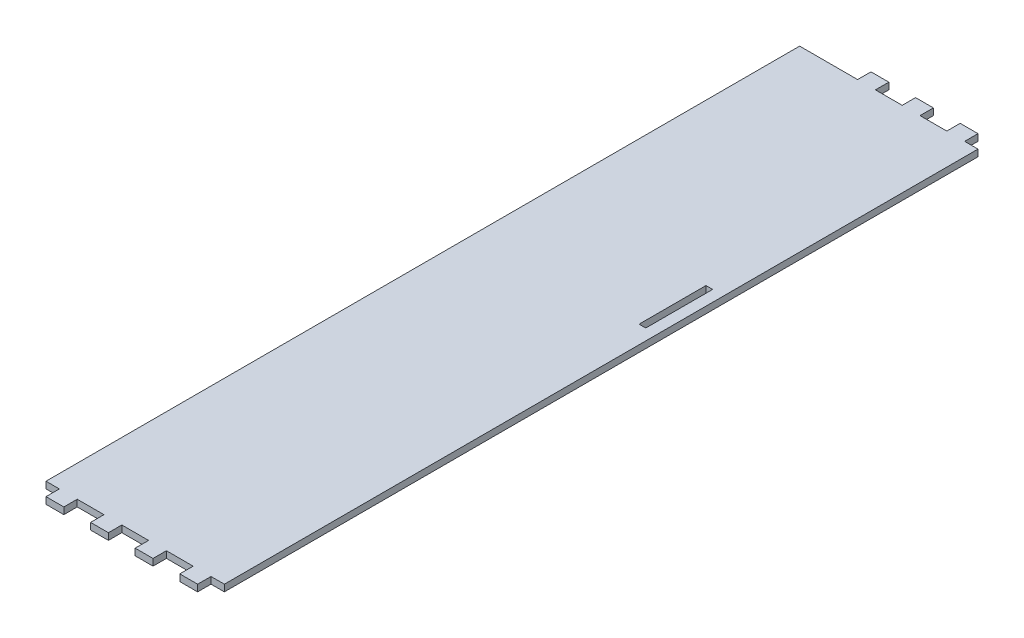
ISO-10303-21;
HEADER;
FILE_DESCRIPTION(('STEP AP214'),'2;1');
FILE_NAME('part.step','',(''),(''),'','','');
FILE_SCHEMA(('AUTOMOTIVE_DESIGN { 1 0 10303 214 1 1 1 1 }'));
ENDSEC;
DATA;
#1=APPLICATION_CONTEXT('core data for automotive mechanical design processes');
#2=APPLICATION_PROTOCOL_DEFINITION('international standard','automotive_design',2000,#1);
#3=PRODUCT_CONTEXT('',#1,'mechanical');
#4=PRODUCT('Part','Part','',(#3));
#5=PRODUCT_RELATED_PRODUCT_CATEGORY('part','',(#4));
#6=PRODUCT_DEFINITION_FORMATION('','',#4);
#7=PRODUCT_DEFINITION_CONTEXT('part definition',#1,'design');
#8=PRODUCT_DEFINITION('design','',#6,#7);
#9=PRODUCT_DEFINITION_SHAPE('','',#8);
#10=(LENGTH_UNIT() NAMED_UNIT(*) SI_UNIT(.MILLI.,.METRE.));
#11=(NAMED_UNIT(*) PLANE_ANGLE_UNIT() SI_UNIT($,.RADIAN.));
#12=(NAMED_UNIT(*) SI_UNIT($,.STERADIAN.) SOLID_ANGLE_UNIT());
#13=UNCERTAINTY_MEASURE_WITH_UNIT(LENGTH_MEASURE(1.E-05),#10,'distance_accuracy_value','');
#14=(GEOMETRIC_REPRESENTATION_CONTEXT(3) GLOBAL_UNCERTAINTY_ASSIGNED_CONTEXT((#13)) GLOBAL_UNIT_ASSIGNED_CONTEXT((#10,
#11,#12)) REPRESENTATION_CONTEXT('',''));
#15=CARTESIAN_POINT('',(0.,0.,0.));
#16=DIRECTION('',(0.,0.,1.));
#17=DIRECTION('',(1.,0.,0.));
#18=AXIS2_PLACEMENT_3D('',#15,#16,#17);
#19=CARTESIAN_POINT('',(0.,0.,338.));
#20=DIRECTION('',(0.,0.,-1.));
#21=DIRECTION('',(-1.,0.,0.));
#22=AXIS2_PLACEMENT_3D('',#19,#20,#21);
#23=PLANE('',#22);
#24=DIRECTION('',(1.,0.,0.));
#25=VECTOR('',#24,1.);
#26=CARTESIAN_POINT('',(0.,0.,338.));
#27=LINE('',#26,#25);
#28=CARTESIAN_POINT('',(54.,0.,338.));
#29=VERTEX_POINT('',#28);
#30=CARTESIAN_POINT('',(66.,0.,338.));
#31=VERTEX_POINT('',#30);
#32=EDGE_CURVE('E451',#29,#31,#27,.T.);
#33=ORIENTED_EDGE('',*,*,#32,.T.);
#34=DIRECTION('',(0.,1.,0.));
#35=VECTOR('',#34,1.);
#36=CARTESIAN_POINT('',(66.,0.,338.));
#37=LINE('',#36,#35);
#38=CARTESIAN_POINT('',(66.,3.,338.));
#39=VERTEX_POINT('',#38);
#40=EDGE_CURVE('E306',#31,#39,#37,.T.);
#41=ORIENTED_EDGE('',*,*,#40,.T.);
#42=DIRECTION('',(-1.,0.,0.));
#43=VECTOR('',#42,1.);
#44=CARTESIAN_POINT('',(0.,3.,338.));
#45=LINE('',#44,#43);
#46=CARTESIAN_POINT('',(54.,3.,338.));
#47=VERTEX_POINT('',#46);
#48=EDGE_CURVE('E450',#39,#47,#45,.T.);
#49=ORIENTED_EDGE('',*,*,#48,.T.);
#50=DIRECTION('',(0.,-1.,0.));
#51=VECTOR('',#50,1.);
#52=CARTESIAN_POINT('',(54.,0.,338.));
#53=LINE('',#52,#51);
#54=EDGE_CURVE('E343',#47,#29,#53,.T.);
#55=ORIENTED_EDGE('',*,*,#54,.T.);
#56=EDGE_LOOP('',(#33,#41,#49,#55));
#57=FACE_BOUND('',#56,.T.);
#58=ADVANCED_FACE('F37',(#57),#23,.F.);
#59=CARTESIAN_POINT('',(34.,0.,338.));
#60=VERTEX_POINT('',#59);
#61=CARTESIAN_POINT('',(46.,0.,338.));
#62=VERTEX_POINT('',#61);
#63=EDGE_CURVE('E432',#60,#62,#27,.T.);
#64=ORIENTED_EDGE('',*,*,#63,.T.);
#65=DIRECTION('',(0.,1.,0.));
#66=VECTOR('',#65,1.);
#67=CARTESIAN_POINT('',(46.,0.,338.));
#68=LINE('',#67,#66);
#69=CARTESIAN_POINT('',(46.,3.,338.));
#70=VERTEX_POINT('',#69);
#71=EDGE_CURVE('E338',#62,#70,#68,.T.);
#72=ORIENTED_EDGE('',*,*,#71,.T.);
#73=CARTESIAN_POINT('',(34.,3.,338.));
#74=VERTEX_POINT('',#73);
#75=EDGE_CURVE('E430',#70,#74,#45,.T.);
#76=ORIENTED_EDGE('',*,*,#75,.T.);
#77=DIRECTION('',(0.,-1.,0.));
#78=VECTOR('',#77,1.);
#79=CARTESIAN_POINT('',(34.,0.,338.));
#80=LINE('',#79,#78);
#81=EDGE_CURVE('E372',#74,#60,#80,.T.);
#82=ORIENTED_EDGE('',*,*,#81,.T.);
#83=EDGE_LOOP('',(#64,#72,#76,#82));
#84=FACE_BOUND('',#83,.T.);
#85=ADVANCED_FACE('F596',(#84),#23,.F.);
#86=CARTESIAN_POINT('',(14.,0.,338.));
#87=VERTEX_POINT('',#86);
#88=CARTESIAN_POINT('',(26.,0.,338.));
#89=VERTEX_POINT('',#88);
#90=EDGE_CURVE('E458',#87,#89,#27,.T.);
#91=ORIENTED_EDGE('',*,*,#90,.T.);
#92=DIRECTION('',(0.,1.,0.));
#93=VECTOR('',#92,1.);
#94=CARTESIAN_POINT('',(26.,0.,338.));
#95=LINE('',#94,#93);
#96=CARTESIAN_POINT('',(26.,3.,338.));
#97=VERTEX_POINT('',#96);
#98=EDGE_CURVE('E367',#89,#97,#95,.T.);
#99=ORIENTED_EDGE('',*,*,#98,.T.);
#100=CARTESIAN_POINT('',(14.,3.,338.));
#101=VERTEX_POINT('',#100);
#102=EDGE_CURVE('E427',#97,#101,#45,.T.);
#103=ORIENTED_EDGE('',*,*,#102,.T.);
#104=DIRECTION('',(0.,-1.,0.));
#105=VECTOR('',#104,1.);
#106=CARTESIAN_POINT('',(14.,0.,338.));
#107=LINE('',#106,#105);
#108=EDGE_CURVE('E401',#101,#87,#107,.T.);
#109=ORIENTED_EDGE('',*,*,#108,.T.);
#110=EDGE_LOOP('',(#91,#99,#103,#109));
#111=FACE_BOUND('',#110,.T.);
#112=ADVANCED_FACE('F545',(#111),#23,.F.);
#113=CARTESIAN_POINT('',(0.,0.,338.));
#114=VERTEX_POINT('',#113);
#115=CARTESIAN_POINT('',(6.,0.,338.));
#116=VERTEX_POINT('',#115);
#117=EDGE_CURVE('E462',#114,#116,#27,.T.);
#118=ORIENTED_EDGE('',*,*,#117,.T.);
#119=DIRECTION('',(0.,1.,0.));
#120=VECTOR('',#119,1.);
#121=CARTESIAN_POINT('',(6.,0.,338.));
#122=LINE('',#121,#120);
#123=CARTESIAN_POINT('',(6.,3.,338.));
#124=VERTEX_POINT('',#123);
#125=EDGE_CURVE('E396',#116,#124,#122,.T.);
#126=ORIENTED_EDGE('',*,*,#125,.T.);
#127=CARTESIAN_POINT('',(0.,3.,338.));
#128=VERTEX_POINT('',#127);
#129=EDGE_CURVE('E431',#124,#128,#45,.T.);
#130=ORIENTED_EDGE('',*,*,#129,.T.);
#131=DIRECTION('',(0.,-1.,0.));
#132=VECTOR('',#131,1.);
#133=CARTESIAN_POINT('',(0.,0.,338.));
#134=LINE('',#133,#132);
#135=EDGE_CURVE('E454',#128,#114,#134,.T.);
#136=ORIENTED_EDGE('',*,*,#135,.T.);
#137=EDGE_LOOP('',(#118,#126,#130,#136));
#138=FACE_BOUND('',#137,.T.);
#139=ADVANCED_FACE('F563',(#138),#23,.F.);
#140=CARTESIAN_POINT('',(0.,0.,0.));
#141=DIRECTION('',(0.,0.,-1.));
#142=DIRECTION('',(-1.,0.,0.));
#143=AXIS2_PLACEMENT_3D('',#140,#141,#142);
#144=PLANE('',#143);
#145=DIRECTION('',(-1.,0.,0.));
#146=VECTOR('',#145,1.);
#147=CARTESIAN_POINT('',(0.,3.,0.));
#148=LINE('',#147,#146);
#149=CARTESIAN_POINT('',(66.,3.,0.));
#150=VERTEX_POINT('',#149);
#151=CARTESIAN_POINT('',(54.,3.,0.));
#152=VERTEX_POINT('',#151);
#153=EDGE_CURVE('E468',#150,#152,#148,.T.);
#154=ORIENTED_EDGE('',*,*,#153,.F.);
#155=DIRECTION('',(0.,1.,0.));
#156=VECTOR('',#155,1.);
#157=CARTESIAN_POINT('',(66.,0.,0.));
#158=LINE('',#157,#156);
#159=CARTESIAN_POINT('',(66.,0.,0.));
#160=VERTEX_POINT('',#159);
#161=EDGE_CURVE('E423',#160,#150,#158,.T.);
#162=ORIENTED_EDGE('',*,*,#161,.F.);
#163=DIRECTION('',(1.,0.,0.));
#164=VECTOR('',#163,1.);
#165=CARTESIAN_POINT('',(0.,0.,0.));
#166=LINE('',#165,#164);
#167=CARTESIAN_POINT('',(54.,0.,0.));
#168=VERTEX_POINT('',#167);
#169=EDGE_CURVE('E467',#168,#160,#166,.T.);
#170=ORIENTED_EDGE('',*,*,#169,.F.);
#171=DIRECTION('',(0.,-1.,0.));
#172=VECTOR('',#171,1.);
#173=CARTESIAN_POINT('',(54.,0.,0.));
#174=LINE('',#173,#172);
#175=EDGE_CURVE('E1018',#152,#168,#174,.T.);
#176=ORIENTED_EDGE('',*,*,#175,.F.);
#177=EDGE_LOOP('',(#154,#162,#170,#176));
#178=FACE_BOUND('',#177,.T.);
#179=ADVANCED_FACE('F614',(#178),#144,.T.);
#180=CARTESIAN_POINT('',(74.,0.,0.));
#181=VERTEX_POINT('',#180);
#182=CARTESIAN_POINT('',(80.,0.,0.));
#183=VERTEX_POINT('',#182);
#184=EDGE_CURVE('E465',#181,#183,#166,.T.);
#185=ORIENTED_EDGE('',*,*,#184,.F.);
#186=DIRECTION('',(0.,-1.,0.));
#187=VECTOR('',#186,1.);
#188=CARTESIAN_POINT('',(74.,0.,0.));
#189=LINE('',#188,#187);
#190=CARTESIAN_POINT('',(74.,3.,0.));
#191=VERTEX_POINT('',#190);
#192=EDGE_CURVE('E1040',#191,#181,#189,.T.);
#193=ORIENTED_EDGE('',*,*,#192,.F.);
#194=CARTESIAN_POINT('',(80.,3.,0.));
#195=VERTEX_POINT('',#194);
#196=EDGE_CURVE('E494',#195,#191,#148,.T.);
#197=ORIENTED_EDGE('',*,*,#196,.F.);
#198=DIRECTION('',(0.,1.,0.));
#199=VECTOR('',#198,1.);
#200=CARTESIAN_POINT('',(80.,0.,0.));
#201=LINE('',#200,#199);
#202=EDGE_CURVE('E473',#183,#195,#201,.T.);
#203=ORIENTED_EDGE('',*,*,#202,.F.);
#204=EDGE_LOOP('',(#185,#193,#197,#203));
#205=FACE_BOUND('',#204,.T.);
#206=ADVANCED_FACE('F619',(#205),#144,.T.);
#207=CARTESIAN_POINT('',(46.,3.,0.));
#208=VERTEX_POINT('',#207);
#209=CARTESIAN_POINT('',(34.,3.,0.));
#210=VERTEX_POINT('',#209);
#211=EDGE_CURVE('E484',#208,#210,#148,.T.);
#212=ORIENTED_EDGE('',*,*,#211,.F.);
#213=DIRECTION('',(0.,1.,0.));
#214=VECTOR('',#213,1.);
#215=CARTESIAN_POINT('',(46.,0.,0.));
#216=LINE('',#215,#214);
#217=CARTESIAN_POINT('',(46.,0.,0.));
#218=VERTEX_POINT('',#217);
#219=EDGE_CURVE('E1002',#218,#208,#216,.T.);
#220=ORIENTED_EDGE('',*,*,#219,.F.);
#221=CARTESIAN_POINT('',(34.,0.,0.));
#222=VERTEX_POINT('',#221);
#223=EDGE_CURVE('E481',#222,#218,#166,.T.);
#224=ORIENTED_EDGE('',*,*,#223,.F.);
#225=DIRECTION('',(0.,-1.,0.));
#226=VECTOR('',#225,1.);
#227=CARTESIAN_POINT('',(34.,0.,0.));
#228=LINE('',#227,#226);
#229=EDGE_CURVE('E978',#210,#222,#228,.T.);
#230=ORIENTED_EDGE('',*,*,#229,.F.);
#231=EDGE_LOOP('',(#212,#220,#224,#230));
#232=FACE_BOUND('',#231,.T.);
#233=ADVANCED_FACE('F724',(#232),#144,.T.);
#234=CARTESIAN_POINT('',(26.,3.,0.));
#235=VERTEX_POINT('',#234);
#236=CARTESIAN_POINT('',(0.,3.,0.));
#237=VERTEX_POINT('',#236);
#238=EDGE_CURVE('E485',#235,#237,#148,.T.);
#239=ORIENTED_EDGE('',*,*,#238,.F.);
#240=DIRECTION('',(0.,1.,0.));
#241=VECTOR('',#240,1.);
#242=CARTESIAN_POINT('',(26.,0.,0.));
#243=LINE('',#242,#241);
#244=CARTESIAN_POINT('',(26.,0.,0.));
#245=VERTEX_POINT('',#244);
#246=EDGE_CURVE('E969',#245,#235,#243,.T.);
#247=ORIENTED_EDGE('',*,*,#246,.F.);
#248=CARTESIAN_POINT('',(0.,0.,0.));
#249=VERTEX_POINT('',#248);
#250=EDGE_CURVE('E478',#249,#245,#166,.T.);
#251=ORIENTED_EDGE('',*,*,#250,.F.);
#252=DIRECTION('',(0.,-1.,0.));
#253=VECTOR('',#252,1.);
#254=CARTESIAN_POINT('',(0.,0.,0.));
#255=LINE('',#254,#253);
#256=EDGE_CURVE('E438',#237,#249,#255,.T.);
#257=ORIENTED_EDGE('',*,*,#256,.F.);
#258=EDGE_LOOP('',(#239,#247,#251,#257));
#259=FACE_BOUND('',#258,.T.);
#260=ADVANCED_FACE('F621',(#259),#144,.T.);
#261=CARTESIAN_POINT('',(0.,0.,338.));
#262=DIRECTION('',(1.,0.,0.));
#263=DIRECTION('',(0.,0.,-1.));
#264=AXIS2_PLACEMENT_3D('',#261,#262,#263);
#265=PLANE('',#264);
#266=ORIENTED_EDGE('',*,*,#256,.T.);
#267=DIRECTION('',(0.,0.,-1.));
#268=VECTOR('',#267,1.);
#269=CARTESIAN_POINT('',(0.,0.,338.));
#270=LINE('',#269,#268);
#271=EDGE_CURVE('E11',#114,#249,#270,.T.);
#272=ORIENTED_EDGE('',*,*,#271,.F.);
#273=ORIENTED_EDGE('',*,*,#135,.F.);
#274=DIRECTION('',(0.,0.,-1.));
#275=VECTOR('',#274,1.);
#276=CARTESIAN_POINT('',(0.,3.,338.));
#277=LINE('',#276,#275);
#278=EDGE_CURVE('E488',#128,#237,#277,.T.);
#279=ORIENTED_EDGE('',*,*,#278,.T.);
#280=EDGE_LOOP('',(#266,#272,#273,#279));
#281=FACE_BOUND('',#280,.T.);
#282=ADVANCED_FACE('F39',(#281),#265,.F.);
#283=CARTESIAN_POINT('',(0.,0.,338.));
#284=DIRECTION('',(0.,1.,0.));
#285=DIRECTION('',(0.,0.,1.));
#286=AXIS2_PLACEMENT_3D('',#283,#284,#285);
#287=PLANE('',#286);
#288=DIRECTION('',(1.,0.,0.));
#289=VECTOR('',#288,1.);
#290=CARTESIAN_POINT('',(72.0000000000006,0.,114.000000000004));
#291=LINE('',#290,#289);
#292=CARTESIAN_POINT('',(72.0000000000006,0.,114.000000000004));
#293=VERTEX_POINT('',#292);
#294=CARTESIAN_POINT('',(75.0000000000006,0.,114.000000000004));
#295=VERTEX_POINT('',#294);
#296=EDGE_CURVE('E300',#293,#295,#291,.T.);
#297=ORIENTED_EDGE('',*,*,#296,.F.);
#298=DIRECTION('',(0.,0.,-1.));
#299=VECTOR('',#298,1.);
#300=CARTESIAN_POINT('',(72.0000000000006,0.,144.000000000004));
#301=LINE('',#300,#299);
#302=CARTESIAN_POINT('',(72.0000000000006,0.,144.000000000004));
#303=VERTEX_POINT('',#302);
#304=EDGE_CURVE('E55',#303,#293,#301,.T.);
#305=ORIENTED_EDGE('',*,*,#304,.F.);
#306=DIRECTION('',(-1.,0.,0.));
#307=VECTOR('',#306,1.);
#308=CARTESIAN_POINT('',(72.0000000000006,0.,144.000000000004));
#309=LINE('',#308,#307);
#310=CARTESIAN_POINT('',(75.0000000000006,0.,144.000000000004));
#311=VERTEX_POINT('',#310);
#312=EDGE_CURVE('E291',#311,#303,#309,.T.);
#313=ORIENTED_EDGE('',*,*,#312,.F.);
#314=DIRECTION('',(0.,0.,1.));
#315=VECTOR('',#314,1.);
#316=CARTESIAN_POINT('',(75.0000000000006,0.,144.000000000004));
#317=LINE('',#316,#315);
#318=EDGE_CURVE('E294',#295,#311,#317,.T.);
#319=ORIENTED_EDGE('',*,*,#318,.F.);
#320=EDGE_LOOP('',(#297,#305,#313,#319));
#321=FACE_BOUND('',#320,.T.);
#322=ORIENTED_EDGE('',*,*,#250,.T.);
#323=DIRECTION('',(0.,0.,1.));
#324=VECTOR('',#323,1.);
#325=CARTESIAN_POINT('',(26.,0.,-6.));
#326=LINE('',#325,#324);
#327=CARTESIAN_POINT('',(26.,0.,-6.));
#328=VERTEX_POINT('',#327);
#329=EDGE_CURVE('E977',#328,#245,#326,.T.);
#330=ORIENTED_EDGE('',*,*,#329,.F.);
#331=DIRECTION('',(-1.,0.,0.));
#332=VECTOR('',#331,1.);
#333=CARTESIAN_POINT('',(26.,0.,-6.));
#334=LINE('',#333,#332);
#335=CARTESIAN_POINT('',(34.,0.,-6.));
#336=VERTEX_POINT('',#335);
#337=EDGE_CURVE('E988',#336,#328,#334,.T.);
#338=ORIENTED_EDGE('',*,*,#337,.F.);
#339=DIRECTION('',(0.,0.,1.));
#340=VECTOR('',#339,1.);
#341=CARTESIAN_POINT('',(34.,0.,-6.));
#342=LINE('',#341,#340);
#343=EDGE_CURVE('E992',#336,#222,#342,.T.);
#344=ORIENTED_EDGE('',*,*,#343,.T.);
#345=ORIENTED_EDGE('',*,*,#223,.T.);
#346=DIRECTION('',(0.,0.,1.));
#347=VECTOR('',#346,1.);
#348=CARTESIAN_POINT('',(46.,0.,-6.));
#349=LINE('',#348,#347);
#350=CARTESIAN_POINT('',(46.,0.,-6.));
#351=VERTEX_POINT('',#350);
#352=EDGE_CURVE('E1005',#351,#218,#349,.T.);
#353=ORIENTED_EDGE('',*,*,#352,.F.);
#354=DIRECTION('',(-1.,0.,0.));
#355=VECTOR('',#354,1.);
#356=CARTESIAN_POINT('',(46.,0.,-6.));
#357=LINE('',#356,#355);
#358=CARTESIAN_POINT('',(54.,0.,-6.));
#359=VERTEX_POINT('',#358);
#360=EDGE_CURVE('E1017',#359,#351,#357,.T.);
#361=ORIENTED_EDGE('',*,*,#360,.F.);
#362=DIRECTION('',(0.,0.,1.));
#363=VECTOR('',#362,1.);
#364=CARTESIAN_POINT('',(54.,0.,-6.));
#365=LINE('',#364,#363);
#366=EDGE_CURVE('E1013',#359,#168,#365,.T.);
#367=ORIENTED_EDGE('',*,*,#366,.T.);
#368=ORIENTED_EDGE('',*,*,#169,.T.);
#369=DIRECTION('',(0.,0.,1.));
#370=VECTOR('',#369,1.);
#371=CARTESIAN_POINT('',(66.,0.,-6.));
#372=LINE('',#371,#370);
#373=CARTESIAN_POINT('',(66.,0.,-6.));
#374=VERTEX_POINT('',#373);
#375=EDGE_CURVE('E1037',#374,#160,#372,.T.);
#376=ORIENTED_EDGE('',*,*,#375,.F.);
#377=DIRECTION('',(-1.,0.,0.));
#378=VECTOR('',#377,1.);
#379=CARTESIAN_POINT('',(66.,0.,-6.));
#380=LINE('',#379,#378);
#381=CARTESIAN_POINT('',(74.,0.,-6.));
#382=VERTEX_POINT('',#381);
#383=EDGE_CURVE('E1039',#382,#374,#380,.T.);
#384=ORIENTED_EDGE('',*,*,#383,.F.);
#385=DIRECTION('',(0.,0.,1.));
#386=VECTOR('',#385,1.);
#387=CARTESIAN_POINT('',(74.,0.,-6.));
#388=LINE('',#387,#386);
#389=EDGE_CURVE('E1034',#382,#181,#388,.T.);
#390=ORIENTED_EDGE('',*,*,#389,.T.);
#391=ORIENTED_EDGE('',*,*,#184,.T.);
#392=DIRECTION('',(0.,0.,-1.));
#393=VECTOR('',#392,1.);
#394=CARTESIAN_POINT('',(80.,0.,338.));
#395=LINE('',#394,#393);
#396=CARTESIAN_POINT('',(80.,0.,338.));
#397=VERTEX_POINT('',#396);
#398=EDGE_CURVE('E47',#397,#183,#395,.T.);
#399=ORIENTED_EDGE('',*,*,#398,.F.);
#400=CARTESIAN_POINT('',(74.,0.,338.));
#401=VERTEX_POINT('',#400);
#402=EDGE_CURVE('E41',#401,#397,#27,.T.);
#403=ORIENTED_EDGE('',*,*,#402,.F.);
#404=DIRECTION('',(0.,0.,-1.));
#405=VECTOR('',#404,1.);
#406=CARTESIAN_POINT('',(74.,0.,344.));
#407=LINE('',#406,#405);
#408=CARTESIAN_POINT('',(74.,0.,344.));
#409=VERTEX_POINT('',#408);
#410=EDGE_CURVE('E332',#409,#401,#407,.T.);
#411=ORIENTED_EDGE('',*,*,#410,.F.);
#412=DIRECTION('',(-1.,0.,0.));
#413=VECTOR('',#412,1.);
#414=CARTESIAN_POINT('',(66.,0.,344.));
#415=LINE('',#414,#413);
#416=CARTESIAN_POINT('',(66.,0.,344.));
#417=VERTEX_POINT('',#416);
#418=EDGE_CURVE('E313',#409,#417,#415,.T.);
#419=ORIENTED_EDGE('',*,*,#418,.T.);
#420=DIRECTION('',(0.,0.,-1.));
#421=VECTOR('',#420,1.);
#422=CARTESIAN_POINT('',(66.,0.,344.));
#423=LINE('',#422,#421);
#424=EDGE_CURVE('E335',#417,#31,#423,.T.);
#425=ORIENTED_EDGE('',*,*,#424,.T.);
#426=ORIENTED_EDGE('',*,*,#32,.F.);
#427=DIRECTION('',(0.,0.,-1.));
#428=VECTOR('',#427,1.);
#429=CARTESIAN_POINT('',(54.,0.,344.));
#430=LINE('',#429,#428);
#431=CARTESIAN_POINT('',(54.,0.,344.));
#432=VERTEX_POINT('',#431);
#433=EDGE_CURVE('E361',#432,#29,#430,.T.);
#434=ORIENTED_EDGE('',*,*,#433,.F.);
#435=DIRECTION('',(-1.,0.,0.));
#436=VECTOR('',#435,1.);
#437=CARTESIAN_POINT('',(46.,0.,344.));
#438=LINE('',#437,#436);
#439=CARTESIAN_POINT('',(46.,0.,344.));
#440=VERTEX_POINT('',#439);
#441=EDGE_CURVE('E342',#432,#440,#438,.T.);
#442=ORIENTED_EDGE('',*,*,#441,.T.);
#443=DIRECTION('',(0.,0.,-1.));
#444=VECTOR('',#443,1.);
#445=CARTESIAN_POINT('',(46.,0.,344.));
#446=LINE('',#445,#444);
#447=EDGE_CURVE('E364',#440,#62,#446,.T.);
#448=ORIENTED_EDGE('',*,*,#447,.T.);
#449=ORIENTED_EDGE('',*,*,#63,.F.);
#450=DIRECTION('',(0.,0.,-1.));
#451=VECTOR('',#450,1.);
#452=CARTESIAN_POINT('',(34.,0.,344.));
#453=LINE('',#452,#451);
#454=CARTESIAN_POINT('',(34.,0.,344.));
#455=VERTEX_POINT('',#454);
#456=EDGE_CURVE('E390',#455,#60,#453,.T.);
#457=ORIENTED_EDGE('',*,*,#456,.F.);
#458=DIRECTION('',(-1.,0.,0.));
#459=VECTOR('',#458,1.);
#460=CARTESIAN_POINT('',(26.,0.,344.));
#461=LINE('',#460,#459);
#462=CARTESIAN_POINT('',(26.,0.,344.));
#463=VERTEX_POINT('',#462);
#464=EDGE_CURVE('E371',#455,#463,#461,.T.);
#465=ORIENTED_EDGE('',*,*,#464,.T.);
#466=DIRECTION('',(0.,0.,-1.));
#467=VECTOR('',#466,1.);
#468=CARTESIAN_POINT('',(26.,0.,344.));
#469=LINE('',#468,#467);
#470=EDGE_CURVE('E393',#463,#89,#469,.T.);
#471=ORIENTED_EDGE('',*,*,#470,.T.);
#472=ORIENTED_EDGE('',*,*,#90,.F.);
#473=DIRECTION('',(0.,0.,-1.));
#474=VECTOR('',#473,1.);
#475=CARTESIAN_POINT('',(14.,0.,344.));
#476=LINE('',#475,#474);
#477=CARTESIAN_POINT('',(14.,0.,344.));
#478=VERTEX_POINT('',#477);
#479=EDGE_CURVE('E424',#478,#87,#476,.T.);
#480=ORIENTED_EDGE('',*,*,#479,.F.);
#481=DIRECTION('',(-1.,0.,0.));
#482=VECTOR('',#481,1.);
#483=CARTESIAN_POINT('',(6.,0.,344.));
#484=LINE('',#483,#482);
#485=CARTESIAN_POINT('',(6.,0.,344.));
#486=VERTEX_POINT('',#485);
#487=EDGE_CURVE('E400',#478,#486,#484,.T.);
#488=ORIENTED_EDGE('',*,*,#487,.T.);
#489=DIRECTION('',(0.,0.,-1.));
#490=VECTOR('',#489,1.);
#491=CARTESIAN_POINT('',(6.,0.,344.));
#492=LINE('',#491,#490);
#493=EDGE_CURVE('E421',#486,#116,#492,.T.);
#494=ORIENTED_EDGE('',*,*,#493,.T.);
#495=ORIENTED_EDGE('',*,*,#117,.F.);
#496=ORIENTED_EDGE('',*,*,#271,.T.);
#497=EDGE_LOOP('',(#322,#330,#338,#344,#345,#353,#361,#367,#368,#376,#384,#390,#391,#399,#403,
#411,#419,#425,#426,#434,#442,#448,#449,#457,#465,#471,#472,#480,#488,#494,#495,#496));
#498=FACE_BOUND('',#497,.T.);
#499=ADVANCED_FACE('F521',(#321,#498),#287,.F.);
#500=CARTESIAN_POINT('',(80.,0.,338.));
#501=DIRECTION('',(-1.,0.,0.));
#502=DIRECTION('',(0.,0.,1.));
#503=AXIS2_PLACEMENT_3D('',#500,#501,#502);
#504=PLANE('',#503);
#505=ORIENTED_EDGE('',*,*,#202,.T.);
#506=DIRECTION('',(0.,0.,-1.));
#507=VECTOR('',#506,1.);
#508=CARTESIAN_POINT('',(80.,3.,338.));
#509=LINE('',#508,#507);
#510=CARTESIAN_POINT('',(80.,3.,338.));
#511=VERTEX_POINT('',#510);
#512=EDGE_CURVE('E498',#511,#195,#509,.T.);
#513=ORIENTED_EDGE('',*,*,#512,.F.);
#514=DIRECTION('',(0.,1.,0.));
#515=VECTOR('',#514,1.);
#516=CARTESIAN_POINT('',(80.,0.,338.));
#517=LINE('',#516,#515);
#518=EDGE_CURVE('E437',#397,#511,#517,.T.);
#519=ORIENTED_EDGE('',*,*,#518,.F.);
#520=ORIENTED_EDGE('',*,*,#398,.T.);
#521=EDGE_LOOP('',(#505,#513,#519,#520));
#522=FACE_BOUND('',#521,.T.);
#523=ADVANCED_FACE('F570',(#522),#504,.F.);
#524=CARTESIAN_POINT('',(0.,3.,338.));
#525=DIRECTION('',(0.,-1.,0.));
#526=DIRECTION('',(0.,0.,-1.));
#527=AXIS2_PLACEMENT_3D('',#524,#525,#526);
#528=PLANE('',#527);
#529=DIRECTION('',(-1.,0.,0.));
#530=VECTOR('',#529,1.);
#531=CARTESIAN_POINT('',(72.0000000000006,3.,144.000000000004));
#532=LINE('',#531,#530);
#533=CARTESIAN_POINT('',(75.0000000000006,3.,144.000000000004));
#534=VERTEX_POINT('',#533);
#535=CARTESIAN_POINT('',(72.0000000000006,3.,144.000000000004));
#536=VERTEX_POINT('',#535);
#537=EDGE_CURVE('E281',#534,#536,#532,.T.);
#538=ORIENTED_EDGE('',*,*,#537,.T.);
#539=DIRECTION('',(0.,0.,-1.));
#540=VECTOR('',#539,1.);
#541=CARTESIAN_POINT('',(72.0000000000006,3.,144.000000000004));
#542=LINE('',#541,#540);
#543=CARTESIAN_POINT('',(72.0000000000006,3.,114.000000000004));
#544=VERTEX_POINT('',#543);
#545=EDGE_CURVE('E275',#536,#544,#542,.T.);
#546=ORIENTED_EDGE('',*,*,#545,.T.);
#547=DIRECTION('',(1.,0.,0.));
#548=VECTOR('',#547,1.);
#549=CARTESIAN_POINT('',(72.0000000000006,3.,114.000000000004));
#550=LINE('',#549,#548);
#551=CARTESIAN_POINT('',(75.0000000000006,3.,114.000000000004));
#552=VERTEX_POINT('',#551);
#553=EDGE_CURVE('E284',#544,#552,#550,.T.);
#554=ORIENTED_EDGE('',*,*,#553,.T.);
#555=DIRECTION('',(0.,0.,1.));
#556=VECTOR('',#555,1.);
#557=CARTESIAN_POINT('',(75.0000000000006,3.,144.000000000004));
#558=LINE('',#557,#556);
#559=EDGE_CURVE('E63',#552,#534,#558,.T.);
#560=ORIENTED_EDGE('',*,*,#559,.T.);
#561=EDGE_LOOP('',(#538,#546,#554,#560));
#562=FACE_BOUND('',#561,.T.);
#563=DIRECTION('',(0.,0.,1.));
#564=VECTOR('',#563,1.);
#565=CARTESIAN_POINT('',(26.,3.,-6.));
#566=LINE('',#565,#564);
#567=CARTESIAN_POINT('',(26.,3.,-6.));
#568=VERTEX_POINT('',#567);
#569=EDGE_CURVE('E971',#568,#235,#566,.T.);
#570=ORIENTED_EDGE('',*,*,#569,.T.);
#571=ORIENTED_EDGE('',*,*,#238,.T.);
#572=ORIENTED_EDGE('',*,*,#278,.F.);
#573=ORIENTED_EDGE('',*,*,#129,.F.);
#574=DIRECTION('',(0.,0.,-1.));
#575=VECTOR('',#574,1.);
#576=CARTESIAN_POINT('',(6.,3.,344.));
#577=LINE('',#576,#575);
#578=CARTESIAN_POINT('',(6.,3.,344.));
#579=VERTEX_POINT('',#578);
#580=EDGE_CURVE('E410',#579,#124,#577,.T.);
#581=ORIENTED_EDGE('',*,*,#580,.F.);
#582=DIRECTION('',(1.,0.,0.));
#583=VECTOR('',#582,1.);
#584=CARTESIAN_POINT('',(6.,3.,344.));
#585=LINE('',#584,#583);
#586=CARTESIAN_POINT('',(14.,3.,344.));
#587=VERTEX_POINT('',#586);
#588=EDGE_CURVE('E407',#579,#587,#585,.T.);
#589=ORIENTED_EDGE('',*,*,#588,.T.);
#590=DIRECTION('',(0.,0.,-1.));
#591=VECTOR('',#590,1.);
#592=CARTESIAN_POINT('',(14.,3.,344.));
#593=LINE('',#592,#591);
#594=EDGE_CURVE('E551',#587,#101,#593,.T.);
#595=ORIENTED_EDGE('',*,*,#594,.T.);
#596=ORIENTED_EDGE('',*,*,#102,.F.);
#597=DIRECTION('',(0.,0.,-1.));
#598=VECTOR('',#597,1.);
#599=CARTESIAN_POINT('',(26.,3.,344.));
#600=LINE('',#599,#598);
#601=CARTESIAN_POINT('',(26.,3.,344.));
#602=VERTEX_POINT('',#601);
#603=EDGE_CURVE('E381',#602,#97,#600,.T.);
#604=ORIENTED_EDGE('',*,*,#603,.F.);
#605=DIRECTION('',(1.,0.,0.));
#606=VECTOR('',#605,1.);
#607=CARTESIAN_POINT('',(26.,3.,344.));
#608=LINE('',#607,#606);
#609=CARTESIAN_POINT('',(34.,3.,344.));
#610=VERTEX_POINT('',#609);
#611=EDGE_CURVE('E378',#602,#610,#608,.T.);
#612=ORIENTED_EDGE('',*,*,#611,.T.);
#613=DIRECTION('',(0.,0.,-1.));
#614=VECTOR('',#613,1.);
#615=CARTESIAN_POINT('',(34.,3.,344.));
#616=LINE('',#615,#614);
#617=EDGE_CURVE('E387',#610,#74,#616,.T.);
#618=ORIENTED_EDGE('',*,*,#617,.T.);
#619=ORIENTED_EDGE('',*,*,#75,.F.);
#620=DIRECTION('',(0.,0.,-1.));
#621=VECTOR('',#620,1.);
#622=CARTESIAN_POINT('',(46.,3.,344.));
#623=LINE('',#622,#621);
#624=CARTESIAN_POINT('',(46.,3.,344.));
#625=VERTEX_POINT('',#624);
#626=EDGE_CURVE('E352',#625,#70,#623,.T.);
#627=ORIENTED_EDGE('',*,*,#626,.F.);
#628=DIRECTION('',(1.,0.,0.));
#629=VECTOR('',#628,1.);
#630=CARTESIAN_POINT('',(46.,3.,344.));
#631=LINE('',#630,#629);
#632=CARTESIAN_POINT('',(54.,3.,344.));
#633=VERTEX_POINT('',#632);
#634=EDGE_CURVE('E349',#625,#633,#631,.T.);
#635=ORIENTED_EDGE('',*,*,#634,.T.);
#636=DIRECTION('',(0.,0.,-1.));
#637=VECTOR('',#636,1.);
#638=CARTESIAN_POINT('',(54.,3.,344.));
#639=LINE('',#638,#637);
#640=EDGE_CURVE('E358',#633,#47,#639,.T.);
#641=ORIENTED_EDGE('',*,*,#640,.T.);
#642=ORIENTED_EDGE('',*,*,#48,.F.);
#643=DIRECTION('',(0.,0.,-1.));
#644=VECTOR('',#643,1.);
#645=CARTESIAN_POINT('',(66.,3.,344.));
#646=LINE('',#645,#644);
#647=CARTESIAN_POINT('',(66.,3.,344.));
#648=VERTEX_POINT('',#647);
#649=EDGE_CURVE('E323',#648,#39,#646,.T.);
#650=ORIENTED_EDGE('',*,*,#649,.F.);
#651=DIRECTION('',(1.,0.,0.));
#652=VECTOR('',#651,1.);
#653=CARTESIAN_POINT('',(66.,3.,344.));
#654=LINE('',#653,#652);
#655=CARTESIAN_POINT('',(74.,3.,344.));
#656=VERTEX_POINT('',#655);
#657=EDGE_CURVE('E320',#648,#656,#654,.T.);
#658=ORIENTED_EDGE('',*,*,#657,.T.);
#659=DIRECTION('',(0.,0.,-1.));
#660=VECTOR('',#659,1.);
#661=CARTESIAN_POINT('',(74.,3.,344.));
#662=LINE('',#661,#660);
#663=CARTESIAN_POINT('',(74.,3.,338.));
#664=VERTEX_POINT('',#663);
#665=EDGE_CURVE('E329',#656,#664,#662,.T.);
#666=ORIENTED_EDGE('',*,*,#665,.T.);
#667=EDGE_CURVE('E447',#511,#664,#45,.T.);
#668=ORIENTED_EDGE('',*,*,#667,.F.);
#669=ORIENTED_EDGE('',*,*,#512,.T.);
#670=ORIENTED_EDGE('',*,*,#196,.T.);
#671=DIRECTION('',(0.,0.,1.));
#672=VECTOR('',#671,1.);
#673=CARTESIAN_POINT('',(74.,3.,-6.));
#674=LINE('',#673,#672);
#675=CARTESIAN_POINT('',(74.,3.,-6.));
#676=VERTEX_POINT('',#675);
#677=EDGE_CURVE('E1032',#676,#191,#674,.T.);
#678=ORIENTED_EDGE('',*,*,#677,.F.);
#679=DIRECTION('',(1.,0.,0.));
#680=VECTOR('',#679,1.);
#681=CARTESIAN_POINT('',(66.,3.,-6.));
#682=LINE('',#681,#680);
#683=CARTESIAN_POINT('',(66.,3.,-6.));
#684=VERTEX_POINT('',#683);
#685=EDGE_CURVE('E1047',#684,#676,#682,.T.);
#686=ORIENTED_EDGE('',*,*,#685,.F.);
#687=DIRECTION('',(0.,0.,1.));
#688=VECTOR('',#687,1.);
#689=CARTESIAN_POINT('',(66.,3.,-6.));
#690=LINE('',#689,#688);
#691=EDGE_CURVE('E1022',#684,#150,#690,.T.);
#692=ORIENTED_EDGE('',*,*,#691,.T.);
#693=ORIENTED_EDGE('',*,*,#153,.T.);
#694=DIRECTION('',(0.,0.,1.));
#695=VECTOR('',#694,1.);
#696=CARTESIAN_POINT('',(54.,3.,-6.));
#697=LINE('',#696,#695);
#698=CARTESIAN_POINT('',(54.,3.,-6.));
#699=VERTEX_POINT('',#698);
#700=EDGE_CURVE('E985',#699,#152,#697,.T.);
#701=ORIENTED_EDGE('',*,*,#700,.F.);
#702=DIRECTION('',(1.,0.,0.));
#703=VECTOR('',#702,1.);
#704=CARTESIAN_POINT('',(46.,3.,-6.));
#705=LINE('',#704,#703);
#706=CARTESIAN_POINT('',(46.,3.,-6.));
#707=VERTEX_POINT('',#706);
#708=EDGE_CURVE('E1026',#707,#699,#705,.T.);
#709=ORIENTED_EDGE('',*,*,#708,.F.);
#710=DIRECTION('',(0.,0.,1.));
#711=VECTOR('',#710,1.);
#712=CARTESIAN_POINT('',(46.,3.,-6.));
#713=LINE('',#712,#711);
#714=EDGE_CURVE('E979',#707,#208,#713,.T.);
#715=ORIENTED_EDGE('',*,*,#714,.T.);
#716=ORIENTED_EDGE('',*,*,#211,.T.);
#717=DIRECTION('',(0.,0.,1.));
#718=VECTOR('',#717,1.);
#719=CARTESIAN_POINT('',(34.,3.,-6.));
#720=LINE('',#719,#718);
#721=CARTESIAN_POINT('',(34.,3.,-6.));
#722=VERTEX_POINT('',#721);
#723=EDGE_CURVE('E976',#722,#210,#720,.T.);
#724=ORIENTED_EDGE('',*,*,#723,.F.);
#725=DIRECTION('',(1.,0.,0.));
#726=VECTOR('',#725,1.);
#727=CARTESIAN_POINT('',(26.,3.,-6.));
#728=LINE('',#727,#726);
#729=EDGE_CURVE('E973',#568,#722,#728,.T.);
#730=ORIENTED_EDGE('',*,*,#729,.F.);
#731=EDGE_LOOP('',(#570,#571,#572,#573,#581,#589,#595,#596,#604,#612,#618,#619,#627,#635,#641,
#642,#650,#658,#666,#668,#669,#670,#678,#686,#692,#693,#701,#709,#715,#716,#724,#730));
#732=FACE_BOUND('',#731,.T.);
#733=ADVANCED_FACE('F288',(#562,#732),#528,.F.);
#734=ORIENTED_EDGE('',*,*,#667,.T.);
#735=DIRECTION('',(0.,-1.,0.));
#736=VECTOR('',#735,1.);
#737=CARTESIAN_POINT('',(74.,0.,338.));
#738=LINE('',#737,#736);
#739=EDGE_CURVE('E314',#664,#401,#738,.T.);
#740=ORIENTED_EDGE('',*,*,#739,.T.);
#741=ORIENTED_EDGE('',*,*,#402,.T.);
#742=ORIENTED_EDGE('',*,*,#518,.T.);
#743=EDGE_LOOP('',(#734,#740,#741,#742));
#744=FACE_BOUND('',#743,.T.);
#745=ADVANCED_FACE('F566',(#744),#23,.F.);
#746=CARTESIAN_POINT('',(26.,0.,-6.));
#747=DIRECTION('',(1.,0.,0.));
#748=DIRECTION('',(0.,0.,-1.));
#749=AXIS2_PLACEMENT_3D('',#746,#747,#748);
#750=PLANE('',#749);
#751=ORIENTED_EDGE('',*,*,#246,.T.);
#752=ORIENTED_EDGE('',*,*,#569,.F.);
#753=DIRECTION('',(0.,1.,0.));
#754=VECTOR('',#753,1.);
#755=CARTESIAN_POINT('',(26.,0.,-6.));
#756=LINE('',#755,#754);
#757=EDGE_CURVE('E982',#328,#568,#756,.T.);
#758=ORIENTED_EDGE('',*,*,#757,.F.);
#759=ORIENTED_EDGE('',*,*,#329,.T.);
#760=EDGE_LOOP('',(#751,#752,#758,#759));
#761=FACE_BOUND('',#760,.T.);
#762=ADVANCED_FACE('F604',(#761),#750,.F.);
#763=CARTESIAN_POINT('',(34.,0.,-6.));
#764=DIRECTION('',(-1.,0.,0.));
#765=DIRECTION('',(0.,0.,1.));
#766=AXIS2_PLACEMENT_3D('',#763,#764,#765);
#767=PLANE('',#766);
#768=ORIENTED_EDGE('',*,*,#229,.T.);
#769=ORIENTED_EDGE('',*,*,#343,.F.);
#770=DIRECTION('',(0.,-1.,0.));
#771=VECTOR('',#770,1.);
#772=CARTESIAN_POINT('',(34.,0.,-6.));
#773=LINE('',#772,#771);
#774=EDGE_CURVE('E999',#722,#336,#773,.T.);
#775=ORIENTED_EDGE('',*,*,#774,.F.);
#776=ORIENTED_EDGE('',*,*,#723,.T.);
#777=EDGE_LOOP('',(#768,#769,#775,#776));
#778=FACE_BOUND('',#777,.T.);
#779=ADVANCED_FACE('F609',(#778),#767,.F.);
#780=CARTESIAN_POINT('',(0.,0.,-6.));
#781=DIRECTION('',(0.,0.,-1.));
#782=DIRECTION('',(-1.,0.,0.));
#783=AXIS2_PLACEMENT_3D('',#780,#781,#782);
#784=PLANE('',#783);
#785=ORIENTED_EDGE('',*,*,#757,.T.);
#786=ORIENTED_EDGE('',*,*,#729,.T.);
#787=ORIENTED_EDGE('',*,*,#774,.T.);
#788=ORIENTED_EDGE('',*,*,#337,.T.);
#789=EDGE_LOOP('',(#785,#786,#787,#788));
#790=FACE_BOUND('',#789,.T.);
#791=ADVANCED_FACE('F693',(#790),#784,.T.);
#792=CARTESIAN_POINT('',(46.,0.,-6.));
#793=DIRECTION('',(1.,0.,0.));
#794=DIRECTION('',(0.,0.,-1.));
#795=AXIS2_PLACEMENT_3D('',#792,#793,#794);
#796=PLANE('',#795);
#797=ORIENTED_EDGE('',*,*,#219,.T.);
#798=ORIENTED_EDGE('',*,*,#714,.F.);
#799=DIRECTION('',(0.,1.,0.));
#800=VECTOR('',#799,1.);
#801=CARTESIAN_POINT('',(46.,0.,-6.));
#802=LINE('',#801,#800);
#803=EDGE_CURVE('E1020',#351,#707,#802,.T.);
#804=ORIENTED_EDGE('',*,*,#803,.F.);
#805=ORIENTED_EDGE('',*,*,#352,.T.);
#806=EDGE_LOOP('',(#797,#798,#804,#805));
#807=FACE_BOUND('',#806,.T.);
#808=ADVANCED_FACE('F683',(#807),#796,.F.);
#809=CARTESIAN_POINT('',(54.,0.,-6.));
#810=DIRECTION('',(-1.,0.,0.));
#811=DIRECTION('',(0.,0.,1.));
#812=AXIS2_PLACEMENT_3D('',#809,#810,#811);
#813=PLANE('',#812);
#814=ORIENTED_EDGE('',*,*,#175,.T.);
#815=ORIENTED_EDGE('',*,*,#366,.F.);
#816=DIRECTION('',(0.,-1.,0.));
#817=VECTOR('',#816,1.);
#818=CARTESIAN_POINT('',(54.,0.,-6.));
#819=LINE('',#818,#817);
#820=EDGE_CURVE('E1024',#699,#359,#819,.T.);
#821=ORIENTED_EDGE('',*,*,#820,.F.);
#822=ORIENTED_EDGE('',*,*,#700,.T.);
#823=EDGE_LOOP('',(#814,#815,#821,#822));
#824=FACE_BOUND('',#823,.T.);
#825=ADVANCED_FACE('F673',(#824),#813,.F.);
#826=CARTESIAN_POINT('',(0.,0.,-6.));
#827=DIRECTION('',(0.,0.,-1.));
#828=DIRECTION('',(-1.,0.,0.));
#829=AXIS2_PLACEMENT_3D('',#826,#827,#828);
#830=PLANE('',#829);
#831=ORIENTED_EDGE('',*,*,#803,.T.);
#832=ORIENTED_EDGE('',*,*,#708,.T.);
#833=ORIENTED_EDGE('',*,*,#820,.T.);
#834=ORIENTED_EDGE('',*,*,#360,.T.);
#835=EDGE_LOOP('',(#831,#832,#833,#834));
#836=FACE_BOUND('',#835,.T.);
#837=ADVANCED_FACE('F663',(#836),#830,.T.);
#838=CARTESIAN_POINT('',(66.,0.,-6.));
#839=DIRECTION('',(1.,0.,0.));
#840=DIRECTION('',(0.,0.,-1.));
#841=AXIS2_PLACEMENT_3D('',#838,#839,#840);
#842=PLANE('',#841);
#843=ORIENTED_EDGE('',*,*,#161,.T.);
#844=ORIENTED_EDGE('',*,*,#691,.F.);
#845=DIRECTION('',(0.,1.,0.));
#846=VECTOR('',#845,1.);
#847=CARTESIAN_POINT('',(66.,0.,-6.));
#848=LINE('',#847,#846);
#849=EDGE_CURVE('E1042',#374,#684,#848,.T.);
#850=ORIENTED_EDGE('',*,*,#849,.F.);
#851=ORIENTED_EDGE('',*,*,#375,.T.);
#852=EDGE_LOOP('',(#843,#844,#850,#851));
#853=FACE_BOUND('',#852,.T.);
#854=ADVANCED_FACE('F653',(#853),#842,.F.);
#855=CARTESIAN_POINT('',(74.,0.,-6.));
#856=DIRECTION('',(-1.,0.,0.));
#857=DIRECTION('',(0.,0.,1.));
#858=AXIS2_PLACEMENT_3D('',#855,#856,#857);
#859=PLANE('',#858);
#860=ORIENTED_EDGE('',*,*,#192,.T.);
#861=ORIENTED_EDGE('',*,*,#389,.F.);
#862=DIRECTION('',(0.,-1.,0.));
#863=VECTOR('',#862,1.);
#864=CARTESIAN_POINT('',(74.,0.,-6.));
#865=LINE('',#864,#863);
#866=EDGE_CURVE('E1045',#676,#382,#865,.T.);
#867=ORIENTED_EDGE('',*,*,#866,.F.);
#868=ORIENTED_EDGE('',*,*,#677,.T.);
#869=EDGE_LOOP('',(#860,#861,#867,#868));
#870=FACE_BOUND('',#869,.T.);
#871=ADVANCED_FACE('F642',(#870),#859,.F.);
#872=CARTESIAN_POINT('',(0.,0.,-6.));
#873=DIRECTION('',(0.,0.,-1.));
#874=DIRECTION('',(-1.,0.,0.));
#875=AXIS2_PLACEMENT_3D('',#872,#873,#874);
#876=PLANE('',#875);
#877=ORIENTED_EDGE('',*,*,#849,.T.);
#878=ORIENTED_EDGE('',*,*,#685,.T.);
#879=ORIENTED_EDGE('',*,*,#866,.T.);
#880=ORIENTED_EDGE('',*,*,#383,.T.);
#881=EDGE_LOOP('',(#877,#878,#879,#880));
#882=FACE_BOUND('',#881,.T.);
#883=ADVANCED_FACE('F593',(#882),#876,.T.);
#884=CARTESIAN_POINT('',(6.,0.,344.));
#885=DIRECTION('',(-1.,0.,0.));
#886=DIRECTION('',(0.,0.,1.));
#887=AXIS2_PLACEMENT_3D('',#884,#885,#886);
#888=PLANE('',#887);
#889=ORIENTED_EDGE('',*,*,#125,.F.);
#890=ORIENTED_EDGE('',*,*,#493,.F.);
#891=DIRECTION('',(0.,1.,0.));
#892=VECTOR('',#891,1.);
#893=CARTESIAN_POINT('',(6.,0.,344.));
#894=LINE('',#893,#892);
#895=EDGE_CURVE('E397',#486,#579,#894,.T.);
#896=ORIENTED_EDGE('',*,*,#895,.T.);
#897=ORIENTED_EDGE('',*,*,#580,.T.);
#898=EDGE_LOOP('',(#889,#890,#896,#897));
#899=FACE_BOUND('',#898,.T.);
#900=ADVANCED_FACE('F558',(#899),#888,.T.);
#901=CARTESIAN_POINT('',(14.,0.,344.));
#902=DIRECTION('',(1.,0.,0.));
#903=DIRECTION('',(0.,0.,-1.));
#904=AXIS2_PLACEMENT_3D('',#901,#902,#903);
#905=PLANE('',#904);
#906=ORIENTED_EDGE('',*,*,#108,.F.);
#907=ORIENTED_EDGE('',*,*,#594,.F.);
#908=DIRECTION('',(0.,-1.,0.));
#909=VECTOR('',#908,1.);
#910=CARTESIAN_POINT('',(14.,0.,344.));
#911=LINE('',#910,#909);
#912=EDGE_CURVE('E404',#587,#478,#911,.T.);
#913=ORIENTED_EDGE('',*,*,#912,.T.);
#914=ORIENTED_EDGE('',*,*,#479,.T.);
#915=EDGE_LOOP('',(#906,#907,#913,#914));
#916=FACE_BOUND('',#915,.T.);
#917=ADVANCED_FACE('F585',(#916),#905,.T.);
#918=CARTESIAN_POINT('',(0.,0.,344.));
#919=DIRECTION('',(0.,0.,1.));
#920=DIRECTION('',(-1.,0.,0.));
#921=AXIS2_PLACEMENT_3D('',#918,#919,#920);
#922=PLANE('',#921);
#923=ORIENTED_EDGE('',*,*,#895,.F.);
#924=ORIENTED_EDGE('',*,*,#487,.F.);
#925=ORIENTED_EDGE('',*,*,#912,.F.);
#926=ORIENTED_EDGE('',*,*,#588,.F.);
#927=EDGE_LOOP('',(#923,#924,#925,#926));
#928=FACE_BOUND('',#927,.T.);
#929=ADVANCED_FACE('F583',(#928),#922,.T.);
#930=CARTESIAN_POINT('',(26.,0.,344.));
#931=DIRECTION('',(-1.,0.,0.));
#932=DIRECTION('',(0.,0.,1.));
#933=AXIS2_PLACEMENT_3D('',#930,#931,#932);
#934=PLANE('',#933);
#935=ORIENTED_EDGE('',*,*,#98,.F.);
#936=ORIENTED_EDGE('',*,*,#470,.F.);
#937=DIRECTION('',(0.,1.,0.));
#938=VECTOR('',#937,1.);
#939=CARTESIAN_POINT('',(26.,0.,344.));
#940=LINE('',#939,#938);
#941=EDGE_CURVE('E368',#463,#602,#940,.T.);
#942=ORIENTED_EDGE('',*,*,#941,.T.);
#943=ORIENTED_EDGE('',*,*,#603,.T.);
#944=EDGE_LOOP('',(#935,#936,#942,#943));
#945=FACE_BOUND('',#944,.T.);
#946=ADVANCED_FACE('F542',(#945),#934,.T.);
#947=CARTESIAN_POINT('',(34.,0.,344.));
#948=DIRECTION('',(1.,0.,0.));
#949=DIRECTION('',(0.,0.,-1.));
#950=AXIS2_PLACEMENT_3D('',#947,#948,#949);
#951=PLANE('',#950);
#952=ORIENTED_EDGE('',*,*,#81,.F.);
#953=ORIENTED_EDGE('',*,*,#617,.F.);
#954=DIRECTION('',(0.,-1.,0.));
#955=VECTOR('',#954,1.);
#956=CARTESIAN_POINT('',(34.,0.,344.));
#957=LINE('',#956,#955);
#958=EDGE_CURVE('E375',#610,#455,#957,.T.);
#959=ORIENTED_EDGE('',*,*,#958,.T.);
#960=ORIENTED_EDGE('',*,*,#456,.T.);
#961=EDGE_LOOP('',(#952,#953,#959,#960));
#962=FACE_BOUND('',#961,.T.);
#963=ADVANCED_FACE('F533',(#962),#951,.T.);
#964=CARTESIAN_POINT('',(0.,0.,344.));
#965=DIRECTION('',(0.,0.,1.));
#966=DIRECTION('',(-1.,0.,0.));
#967=AXIS2_PLACEMENT_3D('',#964,#965,#966);
#968=PLANE('',#967);
#969=ORIENTED_EDGE('',*,*,#941,.F.);
#970=ORIENTED_EDGE('',*,*,#464,.F.);
#971=ORIENTED_EDGE('',*,*,#958,.F.);
#972=ORIENTED_EDGE('',*,*,#611,.F.);
#973=EDGE_LOOP('',(#969,#970,#971,#972));
#974=FACE_BOUND('',#973,.T.);
#975=ADVANCED_FACE('F538',(#974),#968,.T.);
#976=CARTESIAN_POINT('',(46.,0.,344.));
#977=DIRECTION('',(-1.,0.,0.));
#978=DIRECTION('',(0.,0.,1.));
#979=AXIS2_PLACEMENT_3D('',#976,#977,#978);
#980=PLANE('',#979);
#981=ORIENTED_EDGE('',*,*,#71,.F.);
#982=ORIENTED_EDGE('',*,*,#447,.F.);
#983=DIRECTION('',(0.,1.,0.));
#984=VECTOR('',#983,1.);
#985=CARTESIAN_POINT('',(46.,0.,344.));
#986=LINE('',#985,#984);
#987=EDGE_CURVE('E339',#440,#625,#986,.T.);
#988=ORIENTED_EDGE('',*,*,#987,.T.);
#989=ORIENTED_EDGE('',*,*,#626,.T.);
#990=EDGE_LOOP('',(#981,#982,#988,#989));
#991=FACE_BOUND('',#990,.T.);
#992=ADVANCED_FACE('F527',(#991),#980,.T.);
#993=CARTESIAN_POINT('',(54.,0.,344.));
#994=DIRECTION('',(1.,0.,0.));
#995=DIRECTION('',(0.,0.,-1.));
#996=AXIS2_PLACEMENT_3D('',#993,#994,#995);
#997=PLANE('',#996);
#998=ORIENTED_EDGE('',*,*,#54,.F.);
#999=ORIENTED_EDGE('',*,*,#640,.F.);
#1000=DIRECTION('',(0.,-1.,0.));
#1001=VECTOR('',#1000,1.);
#1002=CARTESIAN_POINT('',(54.,0.,344.));
#1003=LINE('',#1002,#1001);
#1004=EDGE_CURVE('E346',#633,#432,#1003,.T.);
#1005=ORIENTED_EDGE('',*,*,#1004,.T.);
#1006=ORIENTED_EDGE('',*,*,#433,.T.);
#1007=EDGE_LOOP('',(#998,#999,#1005,#1006));
#1008=FACE_BOUND('',#1007,.T.);
#1009=ADVANCED_FACE('F518',(#1008),#997,.T.);
#1010=CARTESIAN_POINT('',(0.,0.,344.));
#1011=DIRECTION('',(0.,0.,1.));
#1012=DIRECTION('',(-1.,0.,0.));
#1013=AXIS2_PLACEMENT_3D('',#1010,#1011,#1012);
#1014=PLANE('',#1013);
#1015=ORIENTED_EDGE('',*,*,#987,.F.);
#1016=ORIENTED_EDGE('',*,*,#441,.F.);
#1017=ORIENTED_EDGE('',*,*,#1004,.F.);
#1018=ORIENTED_EDGE('',*,*,#634,.F.);
#1019=EDGE_LOOP('',(#1015,#1016,#1017,#1018));
#1020=FACE_BOUND('',#1019,.T.);
#1021=ADVANCED_FACE('F524',(#1020),#1014,.T.);
#1022=CARTESIAN_POINT('',(66.,0.,344.));
#1023=DIRECTION('',(-1.,0.,0.));
#1024=DIRECTION('',(0.,0.,1.));
#1025=AXIS2_PLACEMENT_3D('',#1022,#1023,#1024);
#1026=PLANE('',#1025);
#1027=ORIENTED_EDGE('',*,*,#40,.F.);
#1028=ORIENTED_EDGE('',*,*,#424,.F.);
#1029=DIRECTION('',(0.,1.,0.));
#1030=VECTOR('',#1029,1.);
#1031=CARTESIAN_POINT('',(66.,0.,344.));
#1032=LINE('',#1031,#1030);
#1033=EDGE_CURVE('E310',#417,#648,#1032,.T.);
#1034=ORIENTED_EDGE('',*,*,#1033,.T.);
#1035=ORIENTED_EDGE('',*,*,#649,.T.);
#1036=EDGE_LOOP('',(#1027,#1028,#1034,#1035));
#1037=FACE_BOUND('',#1036,.T.);
#1038=ADVANCED_FACE('F826',(#1037),#1026,.T.);
#1039=CARTESIAN_POINT('',(74.,0.,344.));
#1040=DIRECTION('',(1.,0.,0.));
#1041=DIRECTION('',(0.,0.,-1.));
#1042=AXIS2_PLACEMENT_3D('',#1039,#1040,#1041);
#1043=PLANE('',#1042);
#1044=ORIENTED_EDGE('',*,*,#739,.F.);
#1045=ORIENTED_EDGE('',*,*,#665,.F.);
#1046=DIRECTION('',(0.,-1.,0.));
#1047=VECTOR('',#1046,1.);
#1048=CARTESIAN_POINT('',(74.,0.,344.));
#1049=LINE('',#1048,#1047);
#1050=EDGE_CURVE('E317',#656,#409,#1049,.T.);
#1051=ORIENTED_EDGE('',*,*,#1050,.T.);
#1052=ORIENTED_EDGE('',*,*,#410,.T.);
#1053=EDGE_LOOP('',(#1044,#1045,#1051,#1052));
#1054=FACE_BOUND('',#1053,.T.);
#1055=ADVANCED_FACE('F576',(#1054),#1043,.T.);
#1056=CARTESIAN_POINT('',(0.,0.,344.));
#1057=DIRECTION('',(0.,0.,1.));
#1058=DIRECTION('',(-1.,0.,0.));
#1059=AXIS2_PLACEMENT_3D('',#1056,#1057,#1058);
#1060=PLANE('',#1059);
#1061=ORIENTED_EDGE('',*,*,#1033,.F.);
#1062=ORIENTED_EDGE('',*,*,#418,.F.);
#1063=ORIENTED_EDGE('',*,*,#1050,.F.);
#1064=ORIENTED_EDGE('',*,*,#657,.F.);
#1065=EDGE_LOOP('',(#1061,#1062,#1063,#1064));
#1066=FACE_BOUND('',#1065,.T.);
#1067=ADVANCED_FACE('F790',(#1066),#1060,.T.);
#1068=CARTESIAN_POINT('',(72.0000000000006,3.,144.000000000004));
#1069=DIRECTION('',(-1.,0.,0.));
#1070=DIRECTION('',(0.,0.,1.));
#1071=AXIS2_PLACEMENT_3D('',#1068,#1069,#1070);
#1072=PLANE('',#1071);
#1073=ORIENTED_EDGE('',*,*,#304,.T.);
#1074=DIRECTION('',(0.,-1.,0.));
#1075=VECTOR('',#1074,1.);
#1076=CARTESIAN_POINT('',(72.0000000000006,3.,114.000000000004));
#1077=LINE('',#1076,#1075);
#1078=EDGE_CURVE('E271',#544,#293,#1077,.T.);
#1079=ORIENTED_EDGE('',*,*,#1078,.F.);
#1080=ORIENTED_EDGE('',*,*,#545,.F.);
#1081=DIRECTION('',(0.,-1.,0.));
#1082=VECTOR('',#1081,1.);
#1083=CARTESIAN_POINT('',(72.0000000000006,3.,144.000000000004));
#1084=LINE('',#1083,#1082);
#1085=EDGE_CURVE('E304',#536,#303,#1084,.T.);
#1086=ORIENTED_EDGE('',*,*,#1085,.T.);
#1087=EDGE_LOOP('',(#1073,#1079,#1080,#1086));
#1088=FACE_BOUND('',#1087,.T.);
#1089=ADVANCED_FACE('F273',(#1088),#1072,.F.);
#1090=CARTESIAN_POINT('',(72.0000000000006,3.,144.000000000004));
#1091=DIRECTION('',(0.,0.,1.));
#1092=DIRECTION('',(1.,0.,0.));
#1093=AXIS2_PLACEMENT_3D('',#1090,#1091,#1092);
#1094=PLANE('',#1093);
#1095=ORIENTED_EDGE('',*,*,#312,.T.);
#1096=ORIENTED_EDGE('',*,*,#1085,.F.);
#1097=ORIENTED_EDGE('',*,*,#537,.F.);
#1098=DIRECTION('',(0.,-1.,0.));
#1099=VECTOR('',#1098,1.);
#1100=CARTESIAN_POINT('',(75.0000000000006,3.,144.000000000004));
#1101=LINE('',#1100,#1099);
#1102=EDGE_CURVE('E307',#534,#311,#1101,.T.);
#1103=ORIENTED_EDGE('',*,*,#1102,.T.);
#1104=EDGE_LOOP('',(#1095,#1096,#1097,#1103));
#1105=FACE_BOUND('',#1104,.T.);
#1106=ADVANCED_FACE('F789',(#1105),#1094,.F.);
#1107=CARTESIAN_POINT('',(75.0000000000006,3.,144.000000000004));
#1108=DIRECTION('',(1.,0.,0.));
#1109=DIRECTION('',(0.,0.,-1.));
#1110=AXIS2_PLACEMENT_3D('',#1107,#1108,#1109);
#1111=PLANE('',#1110);
#1112=ORIENTED_EDGE('',*,*,#318,.T.);
#1113=ORIENTED_EDGE('',*,*,#1102,.F.);
#1114=ORIENTED_EDGE('',*,*,#559,.F.);
#1115=DIRECTION('',(0.,-1.,0.));
#1116=VECTOR('',#1115,1.);
#1117=CARTESIAN_POINT('',(75.0000000000006,3.,114.000000000004));
#1118=LINE('',#1117,#1116);
#1119=EDGE_CURVE('E280',#552,#295,#1118,.T.);
#1120=ORIENTED_EDGE('',*,*,#1119,.T.);
#1121=EDGE_LOOP('',(#1112,#1113,#1114,#1120));
#1122=FACE_BOUND('',#1121,.T.);
#1123=ADVANCED_FACE('F800',(#1122),#1111,.F.);
#1124=CARTESIAN_POINT('',(72.0000000000006,3.,114.000000000004));
#1125=DIRECTION('',(0.,0.,-1.));
#1126=DIRECTION('',(-1.,0.,0.));
#1127=AXIS2_PLACEMENT_3D('',#1124,#1125,#1126);
#1128=PLANE('',#1127);
#1129=ORIENTED_EDGE('',*,*,#296,.T.);
#1130=ORIENTED_EDGE('',*,*,#1119,.F.);
#1131=ORIENTED_EDGE('',*,*,#553,.F.);
#1132=ORIENTED_EDGE('',*,*,#1078,.T.);
#1133=EDGE_LOOP('',(#1129,#1130,#1131,#1132));
#1134=FACE_BOUND('',#1133,.T.);
#1135=ADVANCED_FACE('F285',(#1134),#1128,.F.);
#1136=CLOSED_SHELL('',(#58,#85,#112,#139,#179,#206,#233,#260,#282,#499,#523,#733,#745,#762,#779,
#791,#808,#825,#837,#854,#871,#883,#900,#917,#929,#946,#963,#975,#992,#1009,#1021,#1038,#1055,
#1067,#1089,#1106,#1123,#1135));
#1137=MANIFOLD_SOLID_BREP('B2',#1136);
#1138=ADVANCED_BREP_SHAPE_REPRESENTATION('',(#18,#1137),#14);
#1139=SHAPE_DEFINITION_REPRESENTATION(#9,#1138);
ENDSEC;
END-ISO-10303-21;
